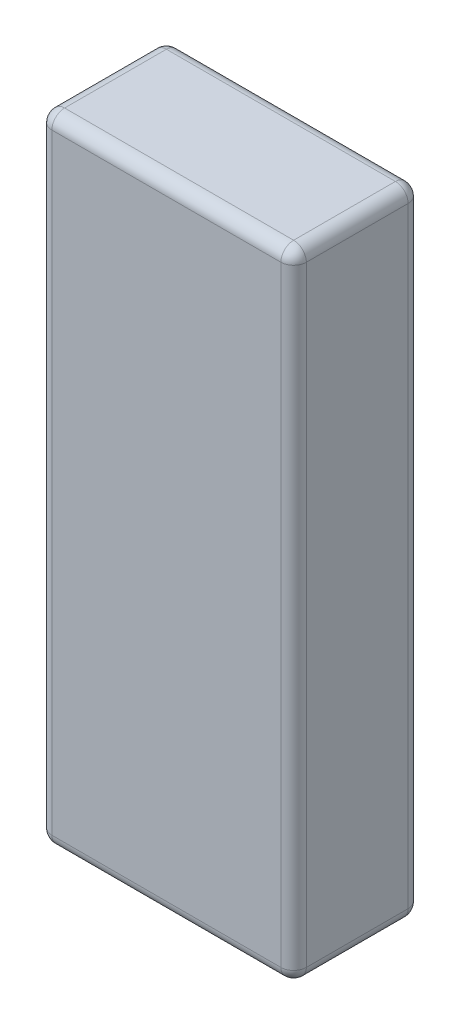
ISO-10303-21;
HEADER;
FILE_DESCRIPTION(('STEP AP214'),'2;1');
FILE_NAME('part.step','',(''),(''),'','','');
FILE_SCHEMA(('AUTOMOTIVE_DESIGN { 1 0 10303 214 1 1 1 1 }'));
ENDSEC;
DATA;
#1=APPLICATION_CONTEXT('core data for automotive mechanical design processes');
#2=APPLICATION_PROTOCOL_DEFINITION('international standard','automotive_design',2000,#1);
#3=PRODUCT_CONTEXT('',#1,'mechanical');
#4=PRODUCT('Part','Part','',(#3));
#5=PRODUCT_RELATED_PRODUCT_CATEGORY('part','',(#4));
#6=PRODUCT_DEFINITION_FORMATION('','',#4);
#7=PRODUCT_DEFINITION_CONTEXT('part definition',#1,'design');
#8=PRODUCT_DEFINITION('design','',#6,#7);
#9=PRODUCT_DEFINITION_SHAPE('','',#8);
#10=(LENGTH_UNIT() NAMED_UNIT(*) SI_UNIT(.MILLI.,.METRE.));
#11=(NAMED_UNIT(*) PLANE_ANGLE_UNIT() SI_UNIT($,.RADIAN.));
#12=(NAMED_UNIT(*) SI_UNIT($,.STERADIAN.) SOLID_ANGLE_UNIT());
#13=UNCERTAINTY_MEASURE_WITH_UNIT(LENGTH_MEASURE(1.E-05),#10,'distance_accuracy_value','');
#14=(GEOMETRIC_REPRESENTATION_CONTEXT(3) GLOBAL_UNCERTAINTY_ASSIGNED_CONTEXT((#13)) GLOBAL_UNIT_ASSIGNED_CONTEXT((#10,
#11,#12)) REPRESENTATION_CONTEXT('',''));
#15=CARTESIAN_POINT('',(0.,0.,0.));
#16=DIRECTION('',(0.,0.,1.));
#17=DIRECTION('',(1.,0.,0.));
#18=AXIS2_PLACEMENT_3D('',#15,#16,#17);
#19=CARTESIAN_POINT('',(10.,-25.,10.));
#20=DIRECTION('',(-1.,0.,0.));
#21=DIRECTION('',(0.,0.,1.));
#22=AXIS2_PLACEMENT_3D('',#19,#20,#21);
#23=PLANE('',#22);
#24=DIRECTION('',(0.,1.,0.));
#25=VECTOR('',#24,1.);
#26=CARTESIAN_POINT('',(10.,-25.,9.));
#27=LINE('',#26,#25);
#28=CARTESIAN_POINT('',(10.,24.,9.));
#29=VERTEX_POINT('',#28);
#30=CARTESIAN_POINT('',(10.,-24.,9.));
#31=VERTEX_POINT('',#30);
#32=EDGE_CURVE('E203',#29,#31,#27,.F.);
#33=ORIENTED_EDGE('',*,*,#32,.T.);
#34=DIRECTION('',(0.,0.,-1.));
#35=VECTOR('',#34,1.);
#36=CARTESIAN_POINT('',(10.,-24.,10.));
#37=LINE('',#36,#35);
#38=CARTESIAN_POINT('',(10.,-24.,0.999999999999999));
#39=VERTEX_POINT('',#38);
#40=EDGE_CURVE('E209',#31,#39,#37,.T.);
#41=ORIENTED_EDGE('',*,*,#40,.T.);
#42=DIRECTION('',(0.,1.,0.));
#43=VECTOR('',#42,1.);
#44=CARTESIAN_POINT('',(10.,25.,0.999999999999999));
#45=LINE('',#44,#43);
#46=CARTESIAN_POINT('',(10.,24.,0.999999999999999));
#47=VERTEX_POINT('',#46);
#48=EDGE_CURVE('E206',#39,#47,#45,.T.);
#49=ORIENTED_EDGE('',*,*,#48,.T.);
#50=DIRECTION('',(0.,0.,-1.));
#51=VECTOR('',#50,1.);
#52=CARTESIAN_POINT('',(10.,24.,10.));
#53=LINE('',#52,#51);
#54=EDGE_CURVE('E200',#47,#29,#53,.F.);
#55=ORIENTED_EDGE('',*,*,#54,.T.);
#56=EDGE_LOOP('',(#33,#41,#49,#55));
#57=FACE_BOUND('',#56,.T.);
#58=ADVANCED_FACE('F39',(#57),#23,.F.);
#59=CARTESIAN_POINT('',(-10.,25.,10.));
#60=DIRECTION('',(0.,-1.,0.));
#61=DIRECTION('',(0.,0.,-1.));
#62=AXIS2_PLACEMENT_3D('',#59,#60,#61);
#63=PLANE('',#62);
#64=DIRECTION('',(0.,0.,-1.));
#65=VECTOR('',#64,1.);
#66=CARTESIAN_POINT('',(-9.00000000000001,25.,10.));
#67=LINE('',#66,#65);
#68=CARTESIAN_POINT('',(-9.00000000000001,25.,0.999999999999999));
#69=VERTEX_POINT('',#68);
#70=CARTESIAN_POINT('',(-9.00000000000001,25.,9.));
#71=VERTEX_POINT('',#70);
#72=EDGE_CURVE('E49',#69,#71,#67,.F.);
#73=ORIENTED_EDGE('',*,*,#72,.T.);
#74=DIRECTION('',(-1.,0.,0.));
#75=VECTOR('',#74,1.);
#76=CARTESIAN_POINT('',(-10.,25.,9.));
#77=LINE('',#76,#75);
#78=CARTESIAN_POINT('',(9.,25.,9.));
#79=VERTEX_POINT('',#78);
#80=EDGE_CURVE('E11',#71,#79,#77,.F.);
#81=ORIENTED_EDGE('',*,*,#80,.T.);
#82=DIRECTION('',(0.,0.,-1.));
#83=VECTOR('',#82,1.);
#84=CARTESIAN_POINT('',(9.,25.,10.));
#85=LINE('',#84,#83);
#86=CARTESIAN_POINT('',(9.,25.,0.999999999999999));
#87=VERTEX_POINT('',#86);
#88=EDGE_CURVE('E229',#79,#87,#85,.T.);
#89=ORIENTED_EDGE('',*,*,#88,.T.);
#90=DIRECTION('',(-1.,0.,0.));
#91=VECTOR('',#90,1.);
#92=CARTESIAN_POINT('',(-10.,25.,0.999999999999999));
#93=LINE('',#92,#91);
#94=EDGE_CURVE('E226',#87,#69,#93,.T.);
#95=ORIENTED_EDGE('',*,*,#94,.T.);
#96=EDGE_LOOP('',(#73,#81,#89,#95));
#97=FACE_BOUND('',#96,.T.);
#98=ADVANCED_FACE('F349',(#97),#63,.F.);
#99=CARTESIAN_POINT('',(-10.,-25.,10.));
#100=DIRECTION('',(1.,0.,0.));
#101=DIRECTION('',(0.,0.,-1.));
#102=AXIS2_PLACEMENT_3D('',#99,#100,#101);
#103=PLANE('',#102);
#104=DIRECTION('',(0.,-1.,0.));
#105=VECTOR('',#104,1.);
#106=CARTESIAN_POINT('',(-10.,-25.,0.999999999999999));
#107=LINE('',#106,#105);
#108=CARTESIAN_POINT('',(-10.,24.,0.999999999999999));
#109=VERTEX_POINT('',#108);
#110=CARTESIAN_POINT('',(-10.,-24.,0.999999999999999));
#111=VERTEX_POINT('',#110);
#112=EDGE_CURVE('E175',#109,#111,#107,.T.);
#113=ORIENTED_EDGE('',*,*,#112,.T.);
#114=DIRECTION('',(0.,0.,-1.));
#115=VECTOR('',#114,1.);
#116=CARTESIAN_POINT('',(-10.,-24.,10.));
#117=LINE('',#116,#115);
#118=CARTESIAN_POINT('',(-10.,-24.,9.));
#119=VERTEX_POINT('',#118);
#120=EDGE_CURVE('E139',#111,#119,#117,.F.);
#121=ORIENTED_EDGE('',*,*,#120,.T.);
#122=DIRECTION('',(0.,-1.,0.));
#123=VECTOR('',#122,1.);
#124=CARTESIAN_POINT('',(-10.,-25.,9.));
#125=LINE('',#124,#123);
#126=CARTESIAN_POINT('',(-10.,24.,9.));
#127=VERTEX_POINT('',#126);
#128=EDGE_CURVE('E182',#119,#127,#125,.F.);
#129=ORIENTED_EDGE('',*,*,#128,.T.);
#130=DIRECTION('',(0.,0.,-1.));
#131=VECTOR('',#130,1.);
#132=CARTESIAN_POINT('',(-10.,24.,10.));
#133=LINE('',#132,#131);
#134=EDGE_CURVE('E171',#127,#109,#133,.T.);
#135=ORIENTED_EDGE('',*,*,#134,.T.);
#136=EDGE_LOOP('',(#113,#121,#129,#135));
#137=FACE_BOUND('',#136,.T.);
#138=ADVANCED_FACE('F382',(#137),#103,.F.);
#139=CARTESIAN_POINT('',(-10.,-25.,10.));
#140=DIRECTION('',(0.,1.,0.));
#141=DIRECTION('',(0.,0.,1.));
#142=AXIS2_PLACEMENT_3D('',#139,#140,#141);
#143=PLANE('',#142);
#144=DIRECTION('',(1.,0.,0.));
#145=VECTOR('',#144,1.);
#146=CARTESIAN_POINT('',(-10.,-25.,9.));
#147=LINE('',#146,#145);
#148=CARTESIAN_POINT('',(9.,-25.,9.));
#149=VERTEX_POINT('',#148);
#150=CARTESIAN_POINT('',(-9.00000000000001,-25.,9.));
#151=VERTEX_POINT('',#150);
#152=EDGE_CURVE('E168',#149,#151,#147,.F.);
#153=ORIENTED_EDGE('',*,*,#152,.T.);
#154=DIRECTION('',(0.,0.,-1.));
#155=VECTOR('',#154,1.);
#156=CARTESIAN_POINT('',(-9.00000000000001,-25.,10.));
#157=LINE('',#156,#155);
#158=CARTESIAN_POINT('',(-9.00000000000001,-25.,0.999999999999999));
#159=VERTEX_POINT('',#158);
#160=EDGE_CURVE('E137',#151,#159,#157,.T.);
#161=ORIENTED_EDGE('',*,*,#160,.T.);
#162=DIRECTION('',(1.,0.,0.));
#163=VECTOR('',#162,1.);
#164=CARTESIAN_POINT('',(10.,-25.,0.999999999999999));
#165=LINE('',#164,#163);
#166=CARTESIAN_POINT('',(9.,-25.,0.999999999999999));
#167=VERTEX_POINT('',#166);
#168=EDGE_CURVE('E157',#159,#167,#165,.T.);
#169=ORIENTED_EDGE('',*,*,#168,.T.);
#170=DIRECTION('',(0.,0.,-1.));
#171=VECTOR('',#170,1.);
#172=CARTESIAN_POINT('',(9.,-25.,10.));
#173=LINE('',#172,#171);
#174=EDGE_CURVE('E164',#167,#149,#173,.F.);
#175=ORIENTED_EDGE('',*,*,#174,.T.);
#176=EDGE_LOOP('',(#153,#161,#169,#175));
#177=FACE_BOUND('',#176,.T.);
#178=ADVANCED_FACE('F166',(#177),#143,.F.);
#179=CARTESIAN_POINT('',(0.,0.,10.));
#180=DIRECTION('',(0.,0.,-1.));
#181=DIRECTION('',(-1.,0.,0.));
#182=AXIS2_PLACEMENT_3D('',#179,#180,#181);
#183=PLANE('',#182);
#184=DIRECTION('',(0.,-1.,0.));
#185=VECTOR('',#184,1.);
#186=CARTESIAN_POINT('',(-9.00000000000001,0.,10.));
#187=LINE('',#186,#185);
#188=CARTESIAN_POINT('',(-9.00000000000001,24.,10.));
#189=VERTEX_POINT('',#188);
#190=CARTESIAN_POINT('',(-9.00000000000001,-24.,10.));
#191=VERTEX_POINT('',#190);
#192=EDGE_CURVE('E190',#189,#191,#187,.T.);
#193=ORIENTED_EDGE('',*,*,#192,.T.);
#194=DIRECTION('',(1.,0.,0.));
#195=VECTOR('',#194,1.);
#196=CARTESIAN_POINT('',(0.,-24.,10.));
#197=LINE('',#196,#195);
#198=CARTESIAN_POINT('',(9.,-24.,10.));
#199=VERTEX_POINT('',#198);
#200=EDGE_CURVE('E196',#191,#199,#197,.T.);
#201=ORIENTED_EDGE('',*,*,#200,.T.);
#202=DIRECTION('',(0.,1.,0.));
#203=VECTOR('',#202,1.);
#204=CARTESIAN_POINT('',(9.,0.,10.));
#205=LINE('',#204,#203);
#206=CARTESIAN_POINT('',(9.,24.,10.));
#207=VERTEX_POINT('',#206);
#208=EDGE_CURVE('E193',#199,#207,#205,.T.);
#209=ORIENTED_EDGE('',*,*,#208,.T.);
#210=DIRECTION('',(-1.,0.,0.));
#211=VECTOR('',#210,1.);
#212=CARTESIAN_POINT('',(0.,24.,10.));
#213=LINE('',#212,#211);
#214=EDGE_CURVE('E187',#207,#189,#213,.T.);
#215=ORIENTED_EDGE('',*,*,#214,.T.);
#216=EDGE_LOOP('',(#193,#201,#209,#215));
#217=FACE_BOUND('',#216,.T.);
#218=ADVANCED_FACE('F322',(#217),#183,.F.);
#219=CARTESIAN_POINT('',(0.,0.,0.));
#220=DIRECTION('',(0.,0.,-1.));
#221=DIRECTION('',(-1.,0.,0.));
#222=AXIS2_PLACEMENT_3D('',#219,#220,#221);
#223=PLANE('',#222);
#224=DIRECTION('',(0.,1.,0.));
#225=VECTOR('',#224,1.);
#226=CARTESIAN_POINT('',(9.,-25.,0.));
#227=LINE('',#226,#225);
#228=CARTESIAN_POINT('',(9.,24.,0.));
#229=VERTEX_POINT('',#228);
#230=CARTESIAN_POINT('',(9.,-24.,0.));
#231=VERTEX_POINT('',#230);
#232=EDGE_CURVE('E219',#229,#231,#227,.F.);
#233=ORIENTED_EDGE('',*,*,#232,.T.);
#234=DIRECTION('',(1.,0.,0.));
#235=VECTOR('',#234,1.);
#236=CARTESIAN_POINT('',(-10.,-24.,0.));
#237=LINE('',#236,#235);
#238=CARTESIAN_POINT('',(-9.00000000000001,-24.,0.));
#239=VERTEX_POINT('',#238);
#240=EDGE_CURVE('E222',#231,#239,#237,.F.);
#241=ORIENTED_EDGE('',*,*,#240,.T.);
#242=DIRECTION('',(0.,-1.,0.));
#243=VECTOR('',#242,1.);
#244=CARTESIAN_POINT('',(-9.00000000000001,25.,0.));
#245=LINE('',#244,#243);
#246=CARTESIAN_POINT('',(-9.00000000000001,24.,0.));
#247=VERTEX_POINT('',#246);
#248=EDGE_CURVE('E216',#239,#247,#245,.F.);
#249=ORIENTED_EDGE('',*,*,#248,.T.);
#250=DIRECTION('',(-1.,0.,0.));
#251=VECTOR('',#250,1.);
#252=CARTESIAN_POINT('',(10.,24.,0.));
#253=LINE('',#252,#251);
#254=EDGE_CURVE('E213',#247,#229,#253,.F.);
#255=ORIENTED_EDGE('',*,*,#254,.T.);
#256=EDGE_LOOP('',(#233,#241,#249,#255));
#257=FACE_BOUND('',#256,.T.);
#258=ADVANCED_FACE('F414',(#257),#223,.T.);
#259=CARTESIAN_POINT('',(9.,24.,10.));
#260=DIRECTION('',(0.,0.,-1.));
#261=DIRECTION('',(-1.,0.,0.));
#262=AXIS2_PLACEMENT_3D('',#259,#260,#261);
#263=CYLINDRICAL_SURFACE('',#262,1.);
#264=CARTESIAN_POINT('',(9.,24.,9.));
#265=DIRECTION('',(0.,0.,1.));
#266=DIRECTION('',(1.,0.,0.));
#267=AXIS2_PLACEMENT_3D('',#264,#265,#266);
#268=CIRCLE('',#267,1.);
#269=EDGE_CURVE('E43',#29,#79,#268,.T.);
#270=ORIENTED_EDGE('',*,*,#269,.F.);
#271=ORIENTED_EDGE('',*,*,#54,.F.);
#272=CARTESIAN_POINT('',(9.,24.,0.999999999999999));
#273=DIRECTION('',(0.,0.,-1.));
#274=DIRECTION('',(-1.,0.,0.));
#275=AXIS2_PLACEMENT_3D('',#272,#273,#274);
#276=CIRCLE('',#275,1.);
#277=EDGE_CURVE('E301',#87,#47,#276,.T.);
#278=ORIENTED_EDGE('',*,*,#277,.F.);
#279=ORIENTED_EDGE('',*,*,#88,.F.);
#280=EDGE_LOOP('',(#270,#271,#278,#279));
#281=FACE_BOUND('',#280,.T.);
#282=ADVANCED_FACE('F41',(#281),#263,.T.);
#283=CARTESIAN_POINT('',(9.,24.,9.));
#284=DIRECTION('',(0.,1.,0.));
#285=DIRECTION('',(-1.,0.,0.));
#286=AXIS2_PLACEMENT_3D('',#283,#284,#285);
#287=SPHERICAL_SURFACE('',#286,1.);
#288=CARTESIAN_POINT('',(9.,24.,9.));
#289=DIRECTION('',(0.,1.,0.));
#290=DIRECTION('',(0.,0.,1.));
#291=AXIS2_PLACEMENT_3D('',#288,#289,#290);
#292=CIRCLE('',#291,1.);
#293=EDGE_CURVE('E294',#29,#207,#292,.F.);
#294=ORIENTED_EDGE('',*,*,#293,.F.);
#295=ORIENTED_EDGE('',*,*,#269,.T.);
#296=CARTESIAN_POINT('',(9.,24.,9.));
#297=DIRECTION('',(1.,0.,0.));
#298=DIRECTION('',(0.,0.,-1.));
#299=AXIS2_PLACEMENT_3D('',#296,#297,#298);
#300=CIRCLE('',#299,1.);
#301=EDGE_CURVE('E298',#207,#79,#300,.F.);
#302=ORIENTED_EDGE('',*,*,#301,.F.);
#303=EDGE_LOOP('',(#294,#295,#302));
#304=FACE_BOUND('',#303,.T.);
#305=ADVANCED_FACE('F314',(#304),#287,.T.);
#306=CARTESIAN_POINT('',(9.,24.,1.));
#307=DIRECTION('',(1.,0.,0.));
#308=DIRECTION('',(0.,0.,-1.));
#309=AXIS2_PLACEMENT_3D('',#306,#307,#308);
#310=SPHERICAL_SURFACE('',#309,1.);
#311=CARTESIAN_POINT('',(9.,24.,1.));
#312=DIRECTION('',(1.,0.,0.));
#313=DIRECTION('',(0.,1.,0.));
#314=AXIS2_PLACEMENT_3D('',#311,#312,#313);
#315=CIRCLE('',#314,1.);
#316=EDGE_CURVE('E286',#87,#229,#315,.F.);
#317=ORIENTED_EDGE('',*,*,#316,.F.);
#318=ORIENTED_EDGE('',*,*,#277,.T.);
#319=CARTESIAN_POINT('',(9.,24.,0.999999999999999));
#320=DIRECTION('',(0.,1.,0.));
#321=DIRECTION('',(0.,0.,1.));
#322=AXIS2_PLACEMENT_3D('',#319,#320,#321);
#323=CIRCLE('',#322,1.);
#324=EDGE_CURVE('E290',#229,#47,#323,.F.);
#325=ORIENTED_EDGE('',*,*,#324,.F.);
#326=EDGE_LOOP('',(#317,#318,#325));
#327=FACE_BOUND('',#326,.T.);
#328=ADVANCED_FACE('F343',(#327),#310,.T.);
#329=CARTESIAN_POINT('',(0.,24.,9.));
#330=DIRECTION('',(-1.,0.,0.));
#331=DIRECTION('',(0.,0.,1.));
#332=AXIS2_PLACEMENT_3D('',#329,#330,#331);
#333=CYLINDRICAL_SURFACE('',#332,1.);
#334=ORIENTED_EDGE('',*,*,#301,.T.);
#335=ORIENTED_EDGE('',*,*,#80,.F.);
#336=CARTESIAN_POINT('',(-9.00000000000001,24.,9.));
#337=DIRECTION('',(-1.,0.,0.));
#338=DIRECTION('',(0.,0.,1.));
#339=AXIS2_PLACEMENT_3D('',#336,#337,#338);
#340=CIRCLE('',#339,1.);
#341=EDGE_CURVE('E57',#189,#71,#340,.T.);
#342=ORIENTED_EDGE('',*,*,#341,.F.);
#343=ORIENTED_EDGE('',*,*,#214,.F.);
#344=EDGE_LOOP('',(#334,#335,#342,#343));
#345=FACE_BOUND('',#344,.T.);
#346=ADVANCED_FACE('F320',(#345),#333,.T.);
#347=CARTESIAN_POINT('',(9.,0.,9.));
#348=DIRECTION('',(0.,1.,0.));
#349=DIRECTION('',(0.,0.,1.));
#350=AXIS2_PLACEMENT_3D('',#347,#348,#349);
#351=CYLINDRICAL_SURFACE('',#350,1.);
#352=ORIENTED_EDGE('',*,*,#293,.T.);
#353=ORIENTED_EDGE('',*,*,#208,.F.);
#354=CARTESIAN_POINT('',(9.,-24.,9.));
#355=DIRECTION('',(0.,-1.,0.));
#356=DIRECTION('',(0.,0.,-1.));
#357=AXIS2_PLACEMENT_3D('',#354,#355,#356);
#358=CIRCLE('',#357,1.);
#359=EDGE_CURVE('E277',#31,#199,#358,.T.);
#360=ORIENTED_EDGE('',*,*,#359,.F.);
#361=ORIENTED_EDGE('',*,*,#32,.F.);
#362=EDGE_LOOP('',(#352,#353,#360,#361));
#363=FACE_BOUND('',#362,.T.);
#364=ADVANCED_FACE('F328',(#363),#351,.T.);
#365=CARTESIAN_POINT('',(9.,-24.,10.));
#366=DIRECTION('',(0.,0.,-1.));
#367=DIRECTION('',(-1.,0.,0.));
#368=AXIS2_PLACEMENT_3D('',#365,#366,#367);
#369=CYLINDRICAL_SURFACE('',#368,1.);
#370=CARTESIAN_POINT('',(9.,-24.,0.999999999999999));
#371=DIRECTION('',(0.,0.,-1.));
#372=DIRECTION('',(-1.,0.,0.));
#373=AXIS2_PLACEMENT_3D('',#370,#371,#372);
#374=CIRCLE('',#373,1.);
#375=EDGE_CURVE('E269',#39,#167,#374,.T.);
#376=ORIENTED_EDGE('',*,*,#375,.F.);
#377=ORIENTED_EDGE('',*,*,#40,.F.);
#378=CARTESIAN_POINT('',(9.,-24.,9.));
#379=DIRECTION('',(0.,0.,1.));
#380=DIRECTION('',(1.,0.,0.));
#381=AXIS2_PLACEMENT_3D('',#378,#379,#380);
#382=CIRCLE('',#381,1.);
#383=EDGE_CURVE('E273',#149,#31,#382,.T.);
#384=ORIENTED_EDGE('',*,*,#383,.F.);
#385=ORIENTED_EDGE('',*,*,#174,.F.);
#386=EDGE_LOOP('',(#376,#377,#384,#385));
#387=FACE_BOUND('',#386,.T.);
#388=ADVANCED_FACE('F334',(#387),#369,.T.);
#389=CARTESIAN_POINT('',(9.,-25.,0.999999999999999));
#390=DIRECTION('',(0.,-1.,0.));
#391=DIRECTION('',(0.,0.,-1.));
#392=AXIS2_PLACEMENT_3D('',#389,#390,#391);
#393=CYLINDRICAL_SURFACE('',#392,1.);
#394=ORIENTED_EDGE('',*,*,#324,.T.);
#395=ORIENTED_EDGE('',*,*,#48,.F.);
#396=CARTESIAN_POINT('',(9.,-24.,1.));
#397=DIRECTION('',(0.,-1.,0.));
#398=DIRECTION('',(0.,0.,-1.));
#399=AXIS2_PLACEMENT_3D('',#396,#397,#398);
#400=CIRCLE('',#399,1.);
#401=EDGE_CURVE('E266',#231,#39,#400,.T.);
#402=ORIENTED_EDGE('',*,*,#401,.F.);
#403=ORIENTED_EDGE('',*,*,#232,.F.);
#404=EDGE_LOOP('',(#394,#395,#402,#403));
#405=FACE_BOUND('',#404,.T.);
#406=ADVANCED_FACE('F340',(#405),#393,.T.);
#407=CARTESIAN_POINT('',(-10.,24.,0.999999999999999));
#408=DIRECTION('',(1.,0.,0.));
#409=DIRECTION('',(0.,0.,-1.));
#410=AXIS2_PLACEMENT_3D('',#407,#408,#409);
#411=CYLINDRICAL_SURFACE('',#410,1.);
#412=ORIENTED_EDGE('',*,*,#316,.T.);
#413=ORIENTED_EDGE('',*,*,#254,.F.);
#414=CARTESIAN_POINT('',(-9.00000000000001,24.,0.999999999999999));
#415=DIRECTION('',(-1.,0.,0.));
#416=DIRECTION('',(0.,0.,1.));
#417=AXIS2_PLACEMENT_3D('',#414,#415,#416);
#418=CIRCLE('',#417,1.);
#419=EDGE_CURVE('E262',#69,#247,#418,.T.);
#420=ORIENTED_EDGE('',*,*,#419,.F.);
#421=ORIENTED_EDGE('',*,*,#94,.F.);
#422=EDGE_LOOP('',(#412,#413,#420,#421));
#423=FACE_BOUND('',#422,.T.);
#424=ADVANCED_FACE('F347',(#423),#411,.T.);
#425=CARTESIAN_POINT('',(-9.00000000000001,24.,10.));
#426=DIRECTION('',(0.,0.,-1.));
#427=DIRECTION('',(-1.,0.,0.));
#428=AXIS2_PLACEMENT_3D('',#425,#426,#427);
#429=CYLINDRICAL_SURFACE('',#428,1.);
#430=CARTESIAN_POINT('',(-9.00000000000001,24.,9.));
#431=DIRECTION('',(0.,0.,1.));
#432=DIRECTION('',(1.,0.,0.));
#433=AXIS2_PLACEMENT_3D('',#430,#431,#432);
#434=CIRCLE('',#433,1.);
#435=EDGE_CURVE('E283',#71,#127,#434,.T.);
#436=ORIENTED_EDGE('',*,*,#435,.F.);
#437=ORIENTED_EDGE('',*,*,#72,.F.);
#438=CARTESIAN_POINT('',(-9.00000000000001,24.,0.999999999999999));
#439=DIRECTION('',(0.,0.,-1.));
#440=DIRECTION('',(-1.,0.,0.));
#441=AXIS2_PLACEMENT_3D('',#438,#439,#440);
#442=CIRCLE('',#441,1.);
#443=EDGE_CURVE('E258',#109,#69,#442,.T.);
#444=ORIENTED_EDGE('',*,*,#443,.F.);
#445=ORIENTED_EDGE('',*,*,#134,.F.);
#446=EDGE_LOOP('',(#436,#437,#444,#445));
#447=FACE_BOUND('',#446,.T.);
#448=ADVANCED_FACE('F352',(#447),#429,.T.);
#449=CARTESIAN_POINT('',(-9.00000000000001,24.,9.));
#450=DIRECTION('',(0.,1.,0.));
#451=DIRECTION('',(0.,0.,1.));
#452=AXIS2_PLACEMENT_3D('',#449,#450,#451);
#453=SPHERICAL_SURFACE('',#452,1.);
#454=ORIENTED_EDGE('',*,*,#341,.T.);
#455=ORIENTED_EDGE('',*,*,#435,.T.);
#456=CARTESIAN_POINT('',(-9.00000000000001,24.,9.));
#457=DIRECTION('',(0.,1.,0.));
#458=DIRECTION('',(0.,0.,1.));
#459=AXIS2_PLACEMENT_3D('',#456,#457,#458);
#460=CIRCLE('',#459,1.);
#461=EDGE_CURVE('E254',#189,#127,#460,.F.);
#462=ORIENTED_EDGE('',*,*,#461,.F.);
#463=EDGE_LOOP('',(#454,#455,#462));
#464=FACE_BOUND('',#463,.T.);
#465=ADVANCED_FACE('F355',(#464),#453,.T.);
#466=CARTESIAN_POINT('',(9.,-24.,9.));
#467=DIRECTION('',(1.,0.,0.));
#468=DIRECTION('',(0.,0.,-1.));
#469=AXIS2_PLACEMENT_3D('',#466,#467,#468);
#470=SPHERICAL_SURFACE('',#469,1.);
#471=ORIENTED_EDGE('',*,*,#383,.T.);
#472=ORIENTED_EDGE('',*,*,#359,.T.);
#473=CARTESIAN_POINT('',(9.,-24.,9.));
#474=DIRECTION('',(1.,0.,0.));
#475=DIRECTION('',(0.,0.,-1.));
#476=AXIS2_PLACEMENT_3D('',#473,#474,#475);
#477=CIRCLE('',#476,1.);
#478=EDGE_CURVE('E251',#149,#199,#477,.F.);
#479=ORIENTED_EDGE('',*,*,#478,.F.);
#480=EDGE_LOOP('',(#471,#472,#479));
#481=FACE_BOUND('',#480,.T.);
#482=ADVANCED_FACE('F366',(#481),#470,.T.);
#483=CARTESIAN_POINT('',(9.,-24.,1.));
#484=DIRECTION('',(1.,0.,0.));
#485=DIRECTION('',(0.,0.,-1.));
#486=AXIS2_PLACEMENT_3D('',#483,#484,#485);
#487=SPHERICAL_SURFACE('',#486,1.);
#488=ORIENTED_EDGE('',*,*,#401,.T.);
#489=ORIENTED_EDGE('',*,*,#375,.T.);
#490=CARTESIAN_POINT('',(9.,-24.,0.999999999999999));
#491=DIRECTION('',(1.,0.,0.));
#492=DIRECTION('',(0.,0.,-1.));
#493=AXIS2_PLACEMENT_3D('',#490,#491,#492);
#494=CIRCLE('',#493,1.);
#495=EDGE_CURVE('E160',#231,#167,#494,.F.);
#496=ORIENTED_EDGE('',*,*,#495,.F.);
#497=EDGE_LOOP('',(#488,#489,#496));
#498=FACE_BOUND('',#497,.T.);
#499=ADVANCED_FACE('F368',(#498),#487,.T.);
#500=CARTESIAN_POINT('',(-9.00000000000001,24.,1.));
#501=DIRECTION('',(0.,1.,0.));
#502=DIRECTION('',(0.,0.,1.));
#503=AXIS2_PLACEMENT_3D('',#500,#501,#502);
#504=SPHERICAL_SURFACE('',#503,1.);
#505=ORIENTED_EDGE('',*,*,#443,.T.);
#506=ORIENTED_EDGE('',*,*,#419,.T.);
#507=CARTESIAN_POINT('',(-9.00000000000001,24.,1.));
#508=DIRECTION('',(0.,1.,0.));
#509=DIRECTION('',(0.,0.,1.));
#510=AXIS2_PLACEMENT_3D('',#507,#508,#509);
#511=CIRCLE('',#510,1.);
#512=EDGE_CURVE('E245',#109,#247,#511,.F.);
#513=ORIENTED_EDGE('',*,*,#512,.F.);
#514=EDGE_LOOP('',(#505,#506,#513));
#515=FACE_BOUND('',#514,.T.);
#516=ADVANCED_FACE('F374',(#515),#504,.T.);
#517=CARTESIAN_POINT('',(-9.00000000000001,0.,9.));
#518=DIRECTION('',(0.,-1.,0.));
#519=DIRECTION('',(0.,0.,-1.));
#520=AXIS2_PLACEMENT_3D('',#517,#518,#519);
#521=CYLINDRICAL_SURFACE('',#520,1.);
#522=ORIENTED_EDGE('',*,*,#461,.T.);
#523=ORIENTED_EDGE('',*,*,#128,.F.);
#524=CARTESIAN_POINT('',(-9.00000000000001,-24.,9.));
#525=DIRECTION('',(0.,-1.,0.));
#526=DIRECTION('',(0.,0.,-1.));
#527=AXIS2_PLACEMENT_3D('',#524,#525,#526);
#528=CIRCLE('',#527,1.);
#529=EDGE_CURVE('E241',#191,#119,#528,.T.);
#530=ORIENTED_EDGE('',*,*,#529,.F.);
#531=ORIENTED_EDGE('',*,*,#192,.F.);
#532=EDGE_LOOP('',(#522,#523,#530,#531));
#533=FACE_BOUND('',#532,.T.);
#534=ADVANCED_FACE('F358',(#533),#521,.T.);
#535=CARTESIAN_POINT('',(0.,-24.,9.));
#536=DIRECTION('',(1.,0.,0.));
#537=DIRECTION('',(0.,0.,-1.));
#538=AXIS2_PLACEMENT_3D('',#535,#536,#537);
#539=CYLINDRICAL_SURFACE('',#538,1.);
#540=ORIENTED_EDGE('',*,*,#478,.T.);
#541=ORIENTED_EDGE('',*,*,#200,.F.);
#542=CARTESIAN_POINT('',(-9.00000000000001,-24.,9.));
#543=DIRECTION('',(-1.,0.,0.));
#544=DIRECTION('',(0.,0.,1.));
#545=AXIS2_PLACEMENT_3D('',#542,#543,#544);
#546=CIRCLE('',#545,1.);
#547=EDGE_CURVE('E154',#151,#191,#546,.T.);
#548=ORIENTED_EDGE('',*,*,#547,.F.);
#549=ORIENTED_EDGE('',*,*,#152,.F.);
#550=EDGE_LOOP('',(#540,#541,#548,#549));
#551=FACE_BOUND('',#550,.T.);
#552=ADVANCED_FACE('F364',(#551),#539,.T.);
#553=CARTESIAN_POINT('',(-10.,-24.,0.999999999999999));
#554=DIRECTION('',(-1.,0.,0.));
#555=DIRECTION('',(0.,0.,1.));
#556=AXIS2_PLACEMENT_3D('',#553,#554,#555);
#557=CYLINDRICAL_SURFACE('',#556,1.);
#558=ORIENTED_EDGE('',*,*,#495,.T.);
#559=ORIENTED_EDGE('',*,*,#168,.F.);
#560=CARTESIAN_POINT('',(-9.00000000000001,-24.,1.));
#561=DIRECTION('',(-1.,0.,0.));
#562=DIRECTION('',(0.,0.,1.));
#563=AXIS2_PLACEMENT_3D('',#560,#561,#562);
#564=CIRCLE('',#563,1.);
#565=EDGE_CURVE('E145',#239,#159,#564,.T.);
#566=ORIENTED_EDGE('',*,*,#565,.F.);
#567=ORIENTED_EDGE('',*,*,#240,.F.);
#568=EDGE_LOOP('',(#558,#559,#566,#567));
#569=FACE_BOUND('',#568,.T.);
#570=ADVANCED_FACE('F158',(#569),#557,.T.);
#571=CARTESIAN_POINT('',(-9.00000000000001,-25.,0.999999999999999));
#572=DIRECTION('',(0.,1.,0.));
#573=DIRECTION('',(0.,0.,1.));
#574=AXIS2_PLACEMENT_3D('',#571,#572,#573);
#575=CYLINDRICAL_SURFACE('',#574,1.);
#576=ORIENTED_EDGE('',*,*,#512,.T.);
#577=ORIENTED_EDGE('',*,*,#248,.F.);
#578=CARTESIAN_POINT('',(-9.00000000000001,-24.,0.999999999999999));
#579=DIRECTION('',(0.,-1.,0.));
#580=DIRECTION('',(0.,0.,-1.));
#581=AXIS2_PLACEMENT_3D('',#578,#579,#580);
#582=CIRCLE('',#581,1.);
#583=EDGE_CURVE('E149',#111,#239,#582,.T.);
#584=ORIENTED_EDGE('',*,*,#583,.F.);
#585=ORIENTED_EDGE('',*,*,#112,.F.);
#586=EDGE_LOOP('',(#576,#577,#584,#585));
#587=FACE_BOUND('',#586,.T.);
#588=ADVANCED_FACE('F392',(#587),#575,.T.);
#589=CARTESIAN_POINT('',(-9.00000000000001,-24.,9.));
#590=DIRECTION('',(0.,0.,1.));
#591=DIRECTION('',(1.,0.,0.));
#592=AXIS2_PLACEMENT_3D('',#589,#590,#591);
#593=SPHERICAL_SURFACE('',#592,1.);
#594=ORIENTED_EDGE('',*,*,#547,.T.);
#595=ORIENTED_EDGE('',*,*,#529,.T.);
#596=CARTESIAN_POINT('',(-9.00000000000001,-24.,9.));
#597=DIRECTION('',(0.,0.,1.));
#598=DIRECTION('',(1.,0.,0.));
#599=AXIS2_PLACEMENT_3D('',#596,#597,#598);
#600=CIRCLE('',#599,1.);
#601=EDGE_CURVE('E142',#151,#119,#600,.F.);
#602=ORIENTED_EDGE('',*,*,#601,.F.);
#603=EDGE_LOOP('',(#594,#595,#602));
#604=FACE_BOUND('',#603,.T.);
#605=ADVANCED_FACE('F362',(#604),#593,.T.);
#606=CARTESIAN_POINT('',(-9.00000000000001,-24.,1.));
#607=DIRECTION('',(0.,0.,-1.));
#608=DIRECTION('',(-1.,0.,0.));
#609=AXIS2_PLACEMENT_3D('',#606,#607,#608);
#610=SPHERICAL_SURFACE('',#609,1.);
#611=ORIENTED_EDGE('',*,*,#583,.T.);
#612=ORIENTED_EDGE('',*,*,#565,.T.);
#613=CARTESIAN_POINT('',(-9.00000000000001,-24.,0.999999999999999));
#614=DIRECTION('',(0.,0.,-1.));
#615=DIRECTION('',(-1.,0.,0.));
#616=AXIS2_PLACEMENT_3D('',#613,#614,#615);
#617=CIRCLE('',#616,1.);
#618=EDGE_CURVE('E133',#111,#159,#617,.F.);
#619=ORIENTED_EDGE('',*,*,#618,.F.);
#620=EDGE_LOOP('',(#611,#612,#619));
#621=FACE_BOUND('',#620,.T.);
#622=ADVANCED_FACE('F147',(#621),#610,.T.);
#623=CARTESIAN_POINT('',(-9.00000000000001,-24.,10.));
#624=DIRECTION('',(0.,0.,-1.));
#625=DIRECTION('',(-1.,0.,0.));
#626=AXIS2_PLACEMENT_3D('',#623,#624,#625);
#627=CYLINDRICAL_SURFACE('',#626,1.);
#628=ORIENTED_EDGE('',*,*,#601,.T.);
#629=ORIENTED_EDGE('',*,*,#120,.F.);
#630=ORIENTED_EDGE('',*,*,#618,.T.);
#631=ORIENTED_EDGE('',*,*,#160,.F.);
#632=EDGE_LOOP('',(#628,#629,#630,#631));
#633=FACE_BOUND('',#632,.T.);
#634=ADVANCED_FACE('F135',(#633),#627,.T.);
#635=CLOSED_SHELL('',(#58,#98,#138,#178,#218,#258,#282,#305,#328,#346,#364,#388,#406,#424,#448,
#465,#482,#499,#516,#534,#552,#570,#588,#605,#622,#634));
#636=MANIFOLD_SOLID_BREP('B2',#635);
#637=ADVANCED_BREP_SHAPE_REPRESENTATION('',(#18,#636),#14);
#638=SHAPE_DEFINITION_REPRESENTATION(#9,#637);
ENDSEC;
END-ISO-10303-21;
